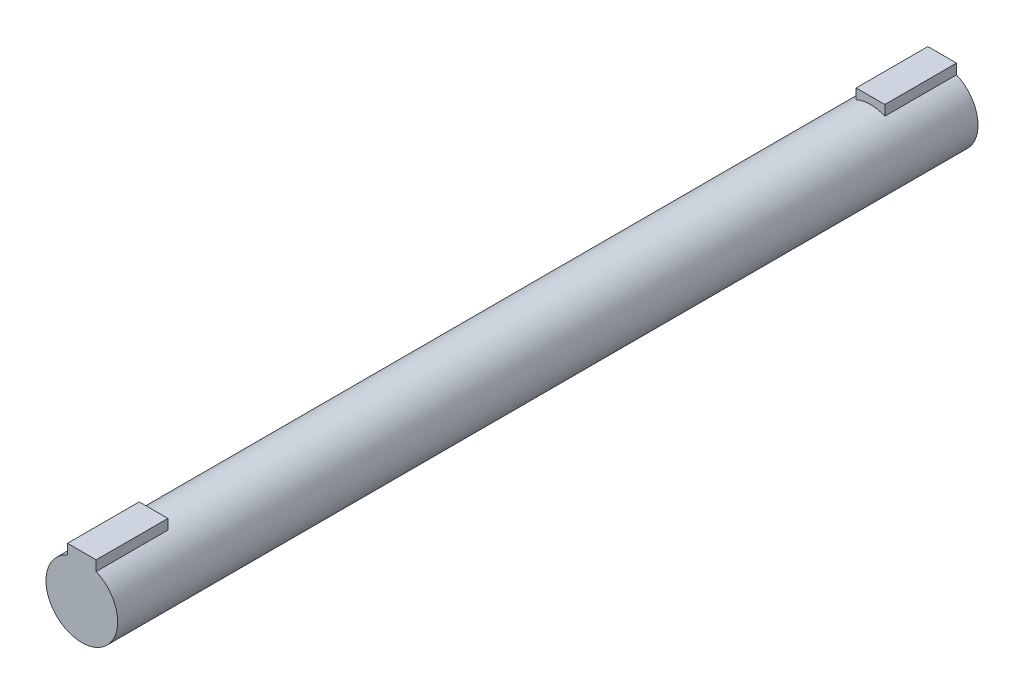
ISO-10303-21;
HEADER;
FILE_DESCRIPTION(('STEP AP214'),'2;1');
FILE_NAME('part.step','',(''),(''),'','','');
FILE_SCHEMA(('AUTOMOTIVE_DESIGN { 1 0 10303 214 1 1 1 1 }'));
ENDSEC;
DATA;
#1=APPLICATION_CONTEXT('core data for automotive mechanical design processes');
#2=APPLICATION_PROTOCOL_DEFINITION('international standard','automotive_design',2000,#1);
#3=PRODUCT_CONTEXT('',#1,'mechanical');
#4=PRODUCT('Part','Part','',(#3));
#5=PRODUCT_RELATED_PRODUCT_CATEGORY('part','',(#4));
#6=PRODUCT_DEFINITION_FORMATION('','',#4);
#7=PRODUCT_DEFINITION_CONTEXT('part definition',#1,'design');
#8=PRODUCT_DEFINITION('design','',#6,#7);
#9=PRODUCT_DEFINITION_SHAPE('','',#8);
#10=(LENGTH_UNIT() NAMED_UNIT(*) SI_UNIT(.MILLI.,.METRE.));
#11=(NAMED_UNIT(*) PLANE_ANGLE_UNIT() SI_UNIT($,.RADIAN.));
#12=(NAMED_UNIT(*) SI_UNIT($,.STERADIAN.) SOLID_ANGLE_UNIT());
#13=UNCERTAINTY_MEASURE_WITH_UNIT(LENGTH_MEASURE(1.E-05),#10,'distance_accuracy_value','');
#14=(GEOMETRIC_REPRESENTATION_CONTEXT(3) GLOBAL_UNCERTAINTY_ASSIGNED_CONTEXT((#13)) GLOBAL_UNIT_ASSIGNED_CONTEXT((#10,
#11,#12)) REPRESENTATION_CONTEXT('',''));
#15=CARTESIAN_POINT('',(0.,0.,0.));
#16=DIRECTION('',(0.,0.,1.));
#17=DIRECTION('',(1.,0.,0.));
#18=AXIS2_PLACEMENT_3D('',#15,#16,#17);
#19=CARTESIAN_POINT('',(-1.,3.,5.));
#20=DIRECTION('',(1.,0.,0.));
#21=DIRECTION('',(0.,0.,-1.));
#22=AXIS2_PLACEMENT_3D('',#19,#20,#21);
#23=PLANE('',#22);
#24=DIRECTION('',(0.,-1.,0.));
#25=VECTOR('',#24,1.);
#26=CARTESIAN_POINT('',(-1.,3.,0.));
#27=LINE('',#26,#25);
#28=CARTESIAN_POINT('',(-1.,3.,0.));
#29=VERTEX_POINT('',#28);
#30=CARTESIAN_POINT('',(-1.,2.29128784747792,0.));
#31=VERTEX_POINT('',#30);
#32=EDGE_CURVE('E138',#29,#31,#27,.T.);
#33=ORIENTED_EDGE('',*,*,#32,.T.);
#34=DIRECTION('',(0.,0.,-1.));
#35=VECTOR('',#34,1.);
#36=CARTESIAN_POINT('',(-1.,2.29128784747792,5.));
#37=LINE('',#36,#35);
#38=CARTESIAN_POINT('',(-1.,2.29128784747792,5.));
#39=VERTEX_POINT('',#38);
#40=EDGE_CURVE('E11',#39,#31,#37,.T.);
#41=ORIENTED_EDGE('',*,*,#40,.F.);
#42=DIRECTION('',(0.,-1.,0.));
#43=VECTOR('',#42,1.);
#44=CARTESIAN_POINT('',(-1.,3.,5.));
#45=LINE('',#44,#43);
#46=CARTESIAN_POINT('',(-1.,3.,5.));
#47=VERTEX_POINT('',#46);
#48=EDGE_CURVE('E80',#47,#39,#45,.T.);
#49=ORIENTED_EDGE('',*,*,#48,.F.);
#50=DIRECTION('',(0.,0.,-1.));
#51=VECTOR('',#50,1.);
#52=CARTESIAN_POINT('',(-1.,3.,5.));
#53=LINE('',#52,#51);
#54=EDGE_CURVE('E144',#47,#29,#53,.T.);
#55=ORIENTED_EDGE('',*,*,#54,.T.);
#56=EDGE_LOOP('',(#33,#41,#49,#55));
#57=FACE_BOUND('',#56,.T.);
#58=ADVANCED_FACE('F33',(#57),#23,.F.);
#59=CARTESIAN_POINT('',(0.,0.,5.));
#60=DIRECTION('',(0.,0.,-1.));
#61=DIRECTION('',(-1.,0.,0.));
#62=AXIS2_PLACEMENT_3D('',#59,#60,#61);
#63=CYLINDRICAL_SURFACE('',#62,2.5);
#64=CARTESIAN_POINT('',(0.,0.,0.));
#65=DIRECTION('',(0.,0.,1.));
#66=DIRECTION('',(1.,0.,0.));
#67=AXIS2_PLACEMENT_3D('',#64,#65,#66);
#68=CIRCLE('',#67,2.5);
#69=CARTESIAN_POINT('',(1.,2.29128784747792,0.));
#70=VERTEX_POINT('',#69);
#71=EDGE_CURVE('E147',#31,#70,#68,.T.);
#72=ORIENTED_EDGE('',*,*,#71,.T.);
#73=DIRECTION('',(0.,0.,-1.));
#74=VECTOR('',#73,1.);
#75=CARTESIAN_POINT('',(1.,2.29128784747792,5.));
#76=LINE('',#75,#74);
#77=CARTESIAN_POINT('',(1.,2.29128784747792,5.));
#78=VERTEX_POINT('',#77);
#79=EDGE_CURVE('E40',#78,#70,#76,.T.);
#80=ORIENTED_EDGE('',*,*,#79,.F.);
#81=CARTESIAN_POINT('',(0.,0.,5.));
#82=DIRECTION('',(0.,0.,1.));
#83=DIRECTION('',(1.,0.,0.));
#84=AXIS2_PLACEMENT_3D('',#81,#82,#83);
#85=CIRCLE('',#84,2.5);
#86=EDGE_CURVE('E130',#78,#39,#85,.T.);
#87=ORIENTED_EDGE('',*,*,#86,.T.);
#88=ORIENTED_EDGE('',*,*,#40,.T.);
#89=EDGE_LOOP('',(#72,#80,#87,#88));
#90=FACE_BOUND('',#89,.T.);
#91=CARTESIAN_POINT('',(0.,0.,55.));
#92=DIRECTION('',(0.,0.,1.));
#93=DIRECTION('',(1.,0.,0.));
#94=AXIS2_PLACEMENT_3D('',#91,#92,#93);
#95=CIRCLE('',#94,2.5);
#96=CARTESIAN_POINT('',(1.,2.29128784747792,55.));
#97=VERTEX_POINT('',#96);
#98=CARTESIAN_POINT('',(-1.,2.29128784747792,55.));
#99=VERTEX_POINT('',#98);
#100=EDGE_CURVE('E47',#97,#99,#95,.T.);
#101=ORIENTED_EDGE('',*,*,#100,.F.);
#102=DIRECTION('',(0.,0.,-1.));
#103=VECTOR('',#102,1.);
#104=CARTESIAN_POINT('',(1.,2.29128784747792,60.));
#105=LINE('',#104,#103);
#106=CARTESIAN_POINT('',(1.,2.29128784747792,60.));
#107=VERTEX_POINT('',#106);
#108=EDGE_CURVE('E113',#107,#97,#105,.T.);
#109=ORIENTED_EDGE('',*,*,#108,.F.);
#110=CARTESIAN_POINT('',(0.,0.,60.));
#111=DIRECTION('',(0.,0.,1.));
#112=DIRECTION('',(1.,0.,0.));
#113=AXIS2_PLACEMENT_3D('',#110,#111,#112);
#114=CIRCLE('',#113,2.5);
#115=CARTESIAN_POINT('',(-1.,2.29128784747792,60.));
#116=VERTEX_POINT('',#115);
#117=EDGE_CURVE('E106',#116,#107,#114,.T.);
#118=ORIENTED_EDGE('',*,*,#117,.F.);
#119=DIRECTION('',(0.,0.,-1.));
#120=VECTOR('',#119,1.);
#121=CARTESIAN_POINT('',(-1.,2.29128784747792,60.));
#122=LINE('',#121,#120);
#123=EDGE_CURVE('E110',#116,#99,#122,.T.);
#124=ORIENTED_EDGE('',*,*,#123,.T.);
#125=EDGE_LOOP('',(#101,#109,#118,#124));
#126=FACE_BOUND('',#125,.T.);
#127=ADVANCED_FACE('F108',(#90,#126),#63,.T.);
#128=CARTESIAN_POINT('',(1.,3.,5.));
#129=DIRECTION('',(-1.,0.,0.));
#130=DIRECTION('',(0.,-1.,0.));
#131=AXIS2_PLACEMENT_3D('',#128,#129,#130);
#132=PLANE('',#131);
#133=DIRECTION('',(0.,1.,0.));
#134=VECTOR('',#133,1.);
#135=CARTESIAN_POINT('',(1.,3.,0.));
#136=LINE('',#135,#134);
#137=CARTESIAN_POINT('',(1.,3.,0.));
#138=VERTEX_POINT('',#137);
#139=EDGE_CURVE('E149',#70,#138,#136,.T.);
#140=ORIENTED_EDGE('',*,*,#139,.T.);
#141=DIRECTION('',(0.,0.,-1.));
#142=VECTOR('',#141,1.);
#143=CARTESIAN_POINT('',(1.,3.,5.));
#144=LINE('',#143,#142);
#145=CARTESIAN_POINT('',(1.,3.,5.));
#146=VERTEX_POINT('',#145);
#147=EDGE_CURVE('E153',#146,#138,#144,.T.);
#148=ORIENTED_EDGE('',*,*,#147,.F.);
#149=DIRECTION('',(0.,1.,0.));
#150=VECTOR('',#149,1.);
#151=CARTESIAN_POINT('',(1.,3.,5.));
#152=LINE('',#151,#150);
#153=EDGE_CURVE('E141',#78,#146,#152,.T.);
#154=ORIENTED_EDGE('',*,*,#153,.F.);
#155=ORIENTED_EDGE('',*,*,#79,.T.);
#156=EDGE_LOOP('',(#140,#148,#154,#155));
#157=FACE_BOUND('',#156,.T.);
#158=ADVANCED_FACE('F158',(#157),#132,.F.);
#159=CARTESIAN_POINT('',(-1.,3.,5.));
#160=DIRECTION('',(0.,-1.,0.));
#161=DIRECTION('',(0.,0.,-1.));
#162=AXIS2_PLACEMENT_3D('',#159,#160,#161);
#163=PLANE('',#162);
#164=DIRECTION('',(-1.,0.,0.));
#165=VECTOR('',#164,1.);
#166=CARTESIAN_POINT('',(-1.,3.,0.));
#167=LINE('',#166,#165);
#168=EDGE_CURVE('E76',#138,#29,#167,.T.);
#169=ORIENTED_EDGE('',*,*,#168,.T.);
#170=ORIENTED_EDGE('',*,*,#54,.F.);
#171=DIRECTION('',(-1.,0.,0.));
#172=VECTOR('',#171,1.);
#173=CARTESIAN_POINT('',(-1.,3.,5.));
#174=LINE('',#173,#172);
#175=EDGE_CURVE('E56',#146,#47,#174,.T.);
#176=ORIENTED_EDGE('',*,*,#175,.F.);
#177=ORIENTED_EDGE('',*,*,#147,.T.);
#178=EDGE_LOOP('',(#169,#170,#176,#177));
#179=FACE_BOUND('',#178,.T.);
#180=ADVANCED_FACE('F165',(#179),#163,.F.);
#181=CARTESIAN_POINT('',(0.,0.,5.));
#182=DIRECTION('',(0.,0.,1.));
#183=DIRECTION('',(1.,0.,0.));
#184=AXIS2_PLACEMENT_3D('',#181,#182,#183);
#185=PLANE('',#184);
#186=ORIENTED_EDGE('',*,*,#86,.F.);
#187=ORIENTED_EDGE('',*,*,#153,.T.);
#188=ORIENTED_EDGE('',*,*,#175,.T.);
#189=ORIENTED_EDGE('',*,*,#48,.T.);
#190=EDGE_LOOP('',(#186,#187,#188,#189));
#191=FACE_BOUND('',#190,.T.);
#192=ADVANCED_FACE('F167',(#191),#185,.T.);
#193=CARTESIAN_POINT('',(0.,0.,0.));
#194=DIRECTION('',(0.,0.,1.));
#195=DIRECTION('',(1.,0.,0.));
#196=AXIS2_PLACEMENT_3D('',#193,#194,#195);
#197=PLANE('',#196);
#198=ORIENTED_EDGE('',*,*,#32,.F.);
#199=ORIENTED_EDGE('',*,*,#168,.F.);
#200=ORIENTED_EDGE('',*,*,#139,.F.);
#201=ORIENTED_EDGE('',*,*,#71,.F.);
#202=EDGE_LOOP('',(#198,#199,#200,#201));
#203=FACE_BOUND('',#202,.T.);
#204=ADVANCED_FACE('F163',(#203),#197,.F.);
#205=CARTESIAN_POINT('',(0.,0.,55.));
#206=DIRECTION('',(0.,0.,1.));
#207=DIRECTION('',(1.,0.,0.));
#208=AXIS2_PLACEMENT_3D('',#205,#206,#207);
#209=PLANE('',#208);
#210=DIRECTION('',(0.,1.,0.));
#211=VECTOR('',#210,1.);
#212=CARTESIAN_POINT('',(1.,3.,55.));
#213=LINE('',#212,#211);
#214=CARTESIAN_POINT('',(1.,3.,55.));
#215=VERTEX_POINT('',#214);
#216=EDGE_CURVE('E268',#97,#215,#213,.T.);
#217=ORIENTED_EDGE('',*,*,#216,.F.);
#218=ORIENTED_EDGE('',*,*,#100,.T.);
#219=DIRECTION('',(0.,-1.,0.));
#220=VECTOR('',#219,1.);
#221=CARTESIAN_POINT('',(-1.,3.,55.));
#222=LINE('',#221,#220);
#223=CARTESIAN_POINT('',(-1.,3.,55.));
#224=VERTEX_POINT('',#223);
#225=EDGE_CURVE('E129',#224,#99,#222,.T.);
#226=ORIENTED_EDGE('',*,*,#225,.F.);
#227=DIRECTION('',(-1.,0.,0.));
#228=VECTOR('',#227,1.);
#229=CARTESIAN_POINT('',(-1.,3.,55.));
#230=LINE('',#229,#228);
#231=EDGE_CURVE('E126',#215,#224,#230,.T.);
#232=ORIENTED_EDGE('',*,*,#231,.F.);
#233=EDGE_LOOP('',(#217,#218,#226,#232));
#234=FACE_BOUND('',#233,.T.);
#235=ADVANCED_FACE('F202',(#234),#209,.F.);
#236=CARTESIAN_POINT('',(-1.,3.,60.));
#237=DIRECTION('',(1.,0.,0.));
#238=DIRECTION('',(0.,0.,-1.));
#239=AXIS2_PLACEMENT_3D('',#236,#237,#238);
#240=PLANE('',#239);
#241=ORIENTED_EDGE('',*,*,#225,.T.);
#242=ORIENTED_EDGE('',*,*,#123,.F.);
#243=DIRECTION('',(0.,-1.,0.));
#244=VECTOR('',#243,1.);
#245=CARTESIAN_POINT('',(-1.,3.,60.));
#246=LINE('',#245,#244);
#247=CARTESIAN_POINT('',(-1.,3.,60.));
#248=VERTEX_POINT('',#247);
#249=EDGE_CURVE('E117',#248,#116,#246,.T.);
#250=ORIENTED_EDGE('',*,*,#249,.F.);
#251=DIRECTION('',(0.,0.,-1.));
#252=VECTOR('',#251,1.);
#253=CARTESIAN_POINT('',(-1.,3.,60.));
#254=LINE('',#253,#252);
#255=EDGE_CURVE('E266',#248,#224,#254,.T.);
#256=ORIENTED_EDGE('',*,*,#255,.T.);
#257=EDGE_LOOP('',(#241,#242,#250,#256));
#258=FACE_BOUND('',#257,.T.);
#259=ADVANCED_FACE('F128',(#258),#240,.F.);
#260=CARTESIAN_POINT('',(1.,3.,60.));
#261=DIRECTION('',(-1.,0.,0.));
#262=DIRECTION('',(0.,0.,1.));
#263=AXIS2_PLACEMENT_3D('',#260,#261,#262);
#264=PLANE('',#263);
#265=ORIENTED_EDGE('',*,*,#216,.T.);
#266=DIRECTION('',(0.,0.,-1.));
#267=VECTOR('',#266,1.);
#268=CARTESIAN_POINT('',(1.,3.,60.));
#269=LINE('',#268,#267);
#270=CARTESIAN_POINT('',(1.,3.,60.));
#271=VERTEX_POINT('',#270);
#272=EDGE_CURVE('E134',#271,#215,#269,.T.);
#273=ORIENTED_EDGE('',*,*,#272,.F.);
#274=DIRECTION('',(0.,1.,0.));
#275=VECTOR('',#274,1.);
#276=CARTESIAN_POINT('',(1.,3.,60.));
#277=LINE('',#276,#275);
#278=EDGE_CURVE('E116',#107,#271,#277,.T.);
#279=ORIENTED_EDGE('',*,*,#278,.F.);
#280=ORIENTED_EDGE('',*,*,#108,.T.);
#281=EDGE_LOOP('',(#265,#273,#279,#280));
#282=FACE_BOUND('',#281,.T.);
#283=ADVANCED_FACE('F233',(#282),#264,.F.);
#284=CARTESIAN_POINT('',(-1.,3.,60.));
#285=DIRECTION('',(0.,-1.,0.));
#286=DIRECTION('',(0.,0.,-1.));
#287=AXIS2_PLACEMENT_3D('',#284,#285,#286);
#288=PLANE('',#287);
#289=ORIENTED_EDGE('',*,*,#231,.T.);
#290=ORIENTED_EDGE('',*,*,#255,.F.);
#291=DIRECTION('',(-1.,0.,0.));
#292=VECTOR('',#291,1.);
#293=CARTESIAN_POINT('',(-1.,3.,60.));
#294=LINE('',#293,#292);
#295=EDGE_CURVE('E122',#271,#248,#294,.T.);
#296=ORIENTED_EDGE('',*,*,#295,.F.);
#297=ORIENTED_EDGE('',*,*,#272,.T.);
#298=EDGE_LOOP('',(#289,#290,#296,#297));
#299=FACE_BOUND('',#298,.T.);
#300=ADVANCED_FACE('F241',(#299),#288,.F.);
#301=CARTESIAN_POINT('',(0.,0.,60.));
#302=DIRECTION('',(0.,0.,1.));
#303=DIRECTION('',(1.,0.,0.));
#304=AXIS2_PLACEMENT_3D('',#301,#302,#303);
#305=PLANE('',#304);
#306=ORIENTED_EDGE('',*,*,#249,.T.);
#307=ORIENTED_EDGE('',*,*,#117,.T.);
#308=ORIENTED_EDGE('',*,*,#278,.T.);
#309=ORIENTED_EDGE('',*,*,#295,.T.);
#310=EDGE_LOOP('',(#306,#307,#308,#309));
#311=FACE_BOUND('',#310,.T.);
#312=ADVANCED_FACE('F120',(#311),#305,.T.);
#313=CLOSED_SHELL('',(#58,#127,#158,#180,#192,#204,#235,#259,#283,#300,#312));
#314=MANIFOLD_SOLID_BREP('B2',#313);
#315=ADVANCED_BREP_SHAPE_REPRESENTATION('',(#18,#314),#14);
#316=SHAPE_DEFINITION_REPRESENTATION(#9,#315);
ENDSEC;
END-ISO-10303-21;
